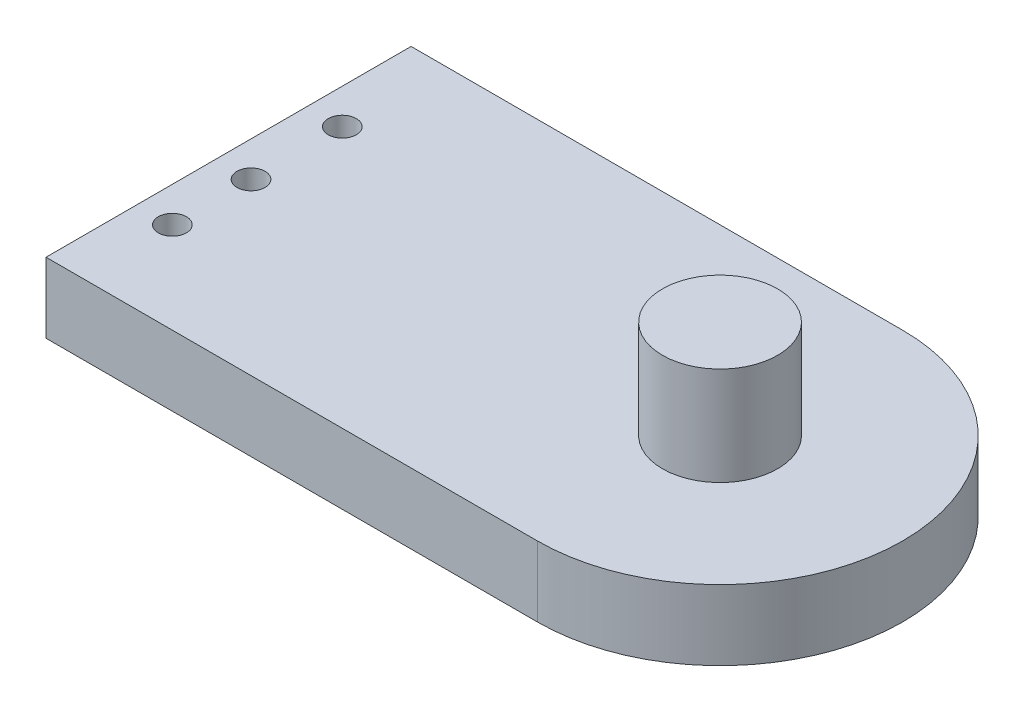
ISO-10303-21;
HEADER;
FILE_DESCRIPTION(('STEP AP214'),'2;1');
FILE_NAME('part.step','',(''),(''),'','','');
FILE_SCHEMA(('AUTOMOTIVE_DESIGN { 1 0 10303 214 1 1 1 1 }'));
ENDSEC;
DATA;
#1=APPLICATION_CONTEXT('core data for automotive mechanical design processes');
#2=APPLICATION_PROTOCOL_DEFINITION('international standard','automotive_design',2000,#1);
#3=PRODUCT_CONTEXT('',#1,'mechanical');
#4=PRODUCT('Part','Part','',(#3));
#5=PRODUCT_RELATED_PRODUCT_CATEGORY('part','',(#4));
#6=PRODUCT_DEFINITION_FORMATION('','',#4);
#7=PRODUCT_DEFINITION_CONTEXT('part definition',#1,'design');
#8=PRODUCT_DEFINITION('design','',#6,#7);
#9=PRODUCT_DEFINITION_SHAPE('','',#8);
#10=(LENGTH_UNIT() NAMED_UNIT(*) SI_UNIT(.MILLI.,.METRE.));
#11=(NAMED_UNIT(*) PLANE_ANGLE_UNIT() SI_UNIT($,.RADIAN.));
#12=(NAMED_UNIT(*) SI_UNIT($,.STERADIAN.) SOLID_ANGLE_UNIT());
#13=UNCERTAINTY_MEASURE_WITH_UNIT(LENGTH_MEASURE(1.E-05),#10,'distance_accuracy_value','');
#14=(GEOMETRIC_REPRESENTATION_CONTEXT(3) GLOBAL_UNCERTAINTY_ASSIGNED_CONTEXT((#13)) GLOBAL_UNIT_ASSIGNED_CONTEXT((#10,
#11,#12)) REPRESENTATION_CONTEXT('',''));
#15=CARTESIAN_POINT('',(0.,0.,0.));
#16=DIRECTION('',(0.,0.,1.));
#17=DIRECTION('',(1.,0.,0.));
#18=AXIS2_PLACEMENT_3D('',#15,#16,#17);
#19=CARTESIAN_POINT('',(0.,5.,0.));
#20=DIRECTION('',(0.,0.,-1.));
#21=DIRECTION('',(-1.,0.,0.));
#22=AXIS2_PLACEMENT_3D('',#19,#20,#21);
#23=PLANE('',#22);
#24=DIRECTION('',(1.,0.,0.));
#25=VECTOR('',#24,1.);
#26=CARTESIAN_POINT('',(0.,0.,0.));
#27=LINE('',#26,#25);
#28=CARTESIAN_POINT('',(0.,0.,0.));
#29=VERTEX_POINT('',#28);
#30=CARTESIAN_POINT('',(35.,0.,0.));
#31=VERTEX_POINT('',#30);
#32=EDGE_CURVE('E109',#29,#31,#27,.T.);
#33=ORIENTED_EDGE('',*,*,#32,.T.);
#34=DIRECTION('',(0.,-1.,0.));
#35=VECTOR('',#34,1.);
#36=CARTESIAN_POINT('',(35.,5.,0.));
#37=LINE('',#36,#35);
#38=CARTESIAN_POINT('',(35.,5.,0.));
#39=VERTEX_POINT('',#38);
#40=EDGE_CURVE('E11',#39,#31,#37,.T.);
#41=ORIENTED_EDGE('',*,*,#40,.F.);
#42=DIRECTION('',(1.,0.,0.));
#43=VECTOR('',#42,1.);
#44=CARTESIAN_POINT('',(0.,5.,0.));
#45=LINE('',#44,#43);
#46=CARTESIAN_POINT('',(0.,5.,0.));
#47=VERTEX_POINT('',#46);
#48=EDGE_CURVE('E95',#47,#39,#45,.T.);
#49=ORIENTED_EDGE('',*,*,#48,.F.);
#50=DIRECTION('',(0.,-1.,0.));
#51=VECTOR('',#50,1.);
#52=CARTESIAN_POINT('',(0.,5.,0.));
#53=LINE('',#52,#51);
#54=EDGE_CURVE('E62',#47,#29,#53,.T.);
#55=ORIENTED_EDGE('',*,*,#54,.T.);
#56=EDGE_LOOP('',(#33,#41,#49,#55));
#57=FACE_BOUND('',#56,.T.);
#58=ADVANCED_FACE('F46',(#57),#23,.F.);
#59=CARTESIAN_POINT('',(35.,5.,-13.));
#60=DIRECTION('',(0.,-1.,0.));
#61=DIRECTION('',(0.,0.,-1.));
#62=AXIS2_PLACEMENT_3D('',#59,#60,#61);
#63=CYLINDRICAL_SURFACE('',#62,13.);
#64=CARTESIAN_POINT('',(35.,0.,-13.));
#65=DIRECTION('',(0.,1.,0.));
#66=DIRECTION('',(0.,0.,1.));
#67=AXIS2_PLACEMENT_3D('',#64,#65,#66);
#68=CIRCLE('',#67,13.);
#69=CARTESIAN_POINT('',(35.,0.,-26.));
#70=VERTEX_POINT('',#69);
#71=EDGE_CURVE('E100',#31,#70,#68,.T.);
#72=ORIENTED_EDGE('',*,*,#71,.T.);
#73=DIRECTION('',(0.,-1.,0.));
#74=VECTOR('',#73,1.);
#75=CARTESIAN_POINT('',(35.,5.,-26.));
#76=LINE('',#75,#74);
#77=CARTESIAN_POINT('',(35.,5.,-26.));
#78=VERTEX_POINT('',#77);
#79=EDGE_CURVE('E54',#78,#70,#76,.T.);
#80=ORIENTED_EDGE('',*,*,#79,.F.);
#81=CARTESIAN_POINT('',(35.,5.,-13.));
#82=DIRECTION('',(0.,1.,0.));
#83=DIRECTION('',(0.,0.,1.));
#84=AXIS2_PLACEMENT_3D('',#81,#82,#83);
#85=CIRCLE('',#84,13.);
#86=EDGE_CURVE('E87',#39,#78,#85,.T.);
#87=ORIENTED_EDGE('',*,*,#86,.F.);
#88=ORIENTED_EDGE('',*,*,#40,.T.);
#89=EDGE_LOOP('',(#72,#80,#87,#88));
#90=FACE_BOUND('',#89,.T.);
#91=ADVANCED_FACE('F99',(#90),#63,.T.);
#92=CARTESIAN_POINT('',(0.,5.,-26.));
#93=DIRECTION('',(0.,0.,-1.));
#94=DIRECTION('',(-1.,0.,0.));
#95=AXIS2_PLACEMENT_3D('',#92,#93,#94);
#96=PLANE('',#95);
#97=DIRECTION('',(1.,0.,0.));
#98=VECTOR('',#97,1.);
#99=CARTESIAN_POINT('',(0.,0.,-26.));
#100=LINE('',#99,#98);
#101=CARTESIAN_POINT('',(0.,0.,-26.));
#102=VERTEX_POINT('',#101);
#103=EDGE_CURVE('E113',#102,#70,#100,.T.);
#104=ORIENTED_EDGE('',*,*,#103,.F.);
#105=DIRECTION('',(0.,-1.,0.));
#106=VECTOR('',#105,1.);
#107=CARTESIAN_POINT('',(0.,5.,-26.));
#108=LINE('',#107,#106);
#109=CARTESIAN_POINT('',(0.,5.,-26.));
#110=VERTEX_POINT('',#109);
#111=EDGE_CURVE('E76',#110,#102,#108,.T.);
#112=ORIENTED_EDGE('',*,*,#111,.F.);
#113=DIRECTION('',(1.,0.,0.));
#114=VECTOR('',#113,1.);
#115=CARTESIAN_POINT('',(0.,5.,-26.));
#116=LINE('',#115,#114);
#117=EDGE_CURVE('E94',#110,#78,#116,.T.);
#118=ORIENTED_EDGE('',*,*,#117,.T.);
#119=ORIENTED_EDGE('',*,*,#79,.T.);
#120=EDGE_LOOP('',(#104,#112,#118,#119));
#121=FACE_BOUND('',#120,.T.);
#122=ADVANCED_FACE('F103',(#121),#96,.T.);
#123=CARTESIAN_POINT('',(0.,5.,0.));
#124=DIRECTION('',(-1.,0.,0.));
#125=DIRECTION('',(0.,0.,1.));
#126=AXIS2_PLACEMENT_3D('',#123,#124,#125);
#127=PLANE('',#126);
#128=DIRECTION('',(0.,0.,-1.));
#129=VECTOR('',#128,1.);
#130=CARTESIAN_POINT('',(0.,0.,0.));
#131=LINE('',#130,#129);
#132=EDGE_CURVE('E115',#29,#102,#131,.T.);
#133=ORIENTED_EDGE('',*,*,#132,.F.);
#134=ORIENTED_EDGE('',*,*,#54,.F.);
#135=DIRECTION('',(0.,0.,-1.));
#136=VECTOR('',#135,1.);
#137=CARTESIAN_POINT('',(0.,5.,0.));
#138=LINE('',#137,#136);
#139=EDGE_CURVE('E104',#47,#110,#138,.T.);
#140=ORIENTED_EDGE('',*,*,#139,.T.);
#141=ORIENTED_EDGE('',*,*,#111,.T.);
#142=EDGE_LOOP('',(#133,#134,#140,#141));
#143=FACE_BOUND('',#142,.T.);
#144=ADVANCED_FACE('F155',(#143),#127,.T.);
#145=CARTESIAN_POINT('',(0.,5.,0.));
#146=DIRECTION('',(0.,1.,0.));
#147=DIRECTION('',(0.,0.,1.));
#148=AXIS2_PLACEMENT_3D('',#145,#146,#147);
#149=PLANE('',#148);
#150=CARTESIAN_POINT('',(2.5,5.,-6.5));
#151=DIRECTION('',(0.,1.,0.));
#152=DIRECTION('',(0.,0.,1.));
#153=AXIS2_PLACEMENT_3D('',#150,#151,#152);
#154=CIRCLE('',#153,0.999999999999988);
#155=CARTESIAN_POINT('',(2.5,5.,-5.50000000000001));
#156=VERTEX_POINT('',#155);
#157=EDGE_CURVE('E138',#156,#156,#154,.T.);
#158=ORIENTED_EDGE('',*,*,#157,.F.);
#159=EDGE_LOOP('',(#158));
#160=FACE_BOUND('',#159,.T.);
#161=CARTESIAN_POINT('',(2.5,5.,-12.1));
#162=DIRECTION('',(0.,1.,0.));
#163=DIRECTION('',(0.,0.,1.));
#164=AXIS2_PLACEMENT_3D('',#161,#162,#163);
#165=CIRCLE('',#164,0.999999999999988);
#166=CARTESIAN_POINT('',(2.5,5.,-11.1));
#167=VERTEX_POINT('',#166);
#168=EDGE_CURVE('E132',#167,#167,#165,.T.);
#169=ORIENTED_EDGE('',*,*,#168,.F.);
#170=EDGE_LOOP('',(#169));
#171=FACE_BOUND('',#170,.T.);
#172=CARTESIAN_POINT('',(2.5,5.,-18.6));
#173=DIRECTION('',(0.,1.,0.));
#174=DIRECTION('',(0.,0.,1.));
#175=AXIS2_PLACEMENT_3D('',#172,#173,#174);
#176=CIRCLE('',#175,0.999999999999988);
#177=CARTESIAN_POINT('',(2.5,5.,-17.6));
#178=VERTEX_POINT('',#177);
#179=EDGE_CURVE('E124',#178,#178,#176,.T.);
#180=ORIENTED_EDGE('',*,*,#179,.F.);
#181=EDGE_LOOP('',(#180));
#182=FACE_BOUND('',#181,.T.);
#183=CARTESIAN_POINT('',(35.,5.,-13.));
#184=DIRECTION('',(0.,1.,0.));
#185=DIRECTION('',(0.,0.,1.));
#186=AXIS2_PLACEMENT_3D('',#183,#184,#185);
#187=CIRCLE('',#186,4.1);
#188=CARTESIAN_POINT('',(35.,5.,-8.9));
#189=VERTEX_POINT('',#188);
#190=EDGE_CURVE('E121',#189,#189,#187,.T.);
#191=ORIENTED_EDGE('',*,*,#190,.F.);
#192=EDGE_LOOP('',(#191));
#193=FACE_BOUND('',#192,.T.);
#194=ORIENTED_EDGE('',*,*,#48,.T.);
#195=ORIENTED_EDGE('',*,*,#86,.T.);
#196=ORIENTED_EDGE('',*,*,#117,.F.);
#197=ORIENTED_EDGE('',*,*,#139,.F.);
#198=EDGE_LOOP('',(#194,#195,#196,#197));
#199=FACE_BOUND('',#198,.T.);
#200=ADVANCED_FACE('F91',(#160,#171,#182,#193,#199),#149,.T.);
#201=CARTESIAN_POINT('',(0.,0.,0.));
#202=DIRECTION('',(0.,1.,0.));
#203=DIRECTION('',(0.,0.,1.));
#204=AXIS2_PLACEMENT_3D('',#201,#202,#203);
#205=PLANE('',#204);
#206=CARTESIAN_POINT('',(2.5,0.,-6.5));
#207=DIRECTION('',(0.,-1.,0.));
#208=DIRECTION('',(0.,0.,-1.));
#209=AXIS2_PLACEMENT_3D('',#206,#207,#208);
#210=CIRCLE('',#209,0.999999999999989);
#211=CARTESIAN_POINT('',(2.5,0.,-7.49999999999999));
#212=VERTEX_POINT('',#211);
#213=EDGE_CURVE('E141',#212,#212,#210,.T.);
#214=ORIENTED_EDGE('',*,*,#213,.F.);
#215=EDGE_LOOP('',(#214));
#216=FACE_BOUND('',#215,.T.);
#217=CARTESIAN_POINT('',(2.5,0.,-12.1));
#218=DIRECTION('',(0.,-1.,0.));
#219=DIRECTION('',(0.,0.,-1.));
#220=AXIS2_PLACEMENT_3D('',#217,#218,#219);
#221=CIRCLE('',#220,0.999999999999989);
#222=CARTESIAN_POINT('',(2.5,0.,-13.1));
#223=VERTEX_POINT('',#222);
#224=EDGE_CURVE('E135',#223,#223,#221,.T.);
#225=ORIENTED_EDGE('',*,*,#224,.F.);
#226=EDGE_LOOP('',(#225));
#227=FACE_BOUND('',#226,.T.);
#228=CARTESIAN_POINT('',(2.5,0.,-18.6));
#229=DIRECTION('',(0.,-1.,0.));
#230=DIRECTION('',(0.,0.,-1.));
#231=AXIS2_PLACEMENT_3D('',#228,#229,#230);
#232=CIRCLE('',#231,0.999999999999989);
#233=CARTESIAN_POINT('',(2.5,0.,-19.6));
#234=VERTEX_POINT('',#233);
#235=EDGE_CURVE('E129',#234,#234,#232,.T.);
#236=ORIENTED_EDGE('',*,*,#235,.F.);
#237=EDGE_LOOP('',(#236));
#238=FACE_BOUND('',#237,.T.);
#239=ORIENTED_EDGE('',*,*,#32,.F.);
#240=ORIENTED_EDGE('',*,*,#132,.T.);
#241=ORIENTED_EDGE('',*,*,#103,.T.);
#242=ORIENTED_EDGE('',*,*,#71,.F.);
#243=EDGE_LOOP('',(#239,#240,#241,#242));
#244=FACE_BOUND('',#243,.T.);
#245=ADVANCED_FACE('F147',(#216,#227,#238,#244),#205,.F.);
#246=CARTESIAN_POINT('',(35.,12.,-13.));
#247=DIRECTION('',(0.,-1.,0.));
#248=DIRECTION('',(0.,0.,-1.));
#249=AXIS2_PLACEMENT_3D('',#246,#247,#248);
#250=CYLINDRICAL_SURFACE('',#249,4.1);
#251=CARTESIAN_POINT('',(35.,12.,-13.));
#252=DIRECTION('',(0.,1.,0.));
#253=DIRECTION('',(0.,0.,1.));
#254=AXIS2_PLACEMENT_3D('',#251,#252,#253);
#255=CIRCLE('',#254,4.1);
#256=CARTESIAN_POINT('',(35.,12.,-8.9));
#257=VERTEX_POINT('',#256);
#258=EDGE_CURVE('E111',#257,#257,#255,.T.);
#259=ORIENTED_EDGE('',*,*,#258,.F.);
#260=EDGE_LOOP('',(#259));
#261=FACE_BOUND('',#260,.T.);
#262=ORIENTED_EDGE('',*,*,#190,.T.);
#263=EDGE_LOOP('',(#262));
#264=FACE_BOUND('',#263,.T.);
#265=ADVANCED_FACE('F150',(#261,#264),#250,.T.);
#266=CARTESIAN_POINT('',(35.,12.,-13.));
#267=DIRECTION('',(0.,1.,0.));
#268=DIRECTION('',(0.,0.,1.));
#269=AXIS2_PLACEMENT_3D('',#266,#267,#268);
#270=PLANE('',#269);
#271=ORIENTED_EDGE('',*,*,#258,.T.);
#272=EDGE_LOOP('',(#271));
#273=FACE_BOUND('',#272,.T.);
#274=ADVANCED_FACE('F210',(#273),#270,.T.);
#275=CARTESIAN_POINT('',(2.5,0.,-18.6));
#276=DIRECTION('',(0.,-1.,0.));
#277=DIRECTION('',(0.,0.,-1.));
#278=AXIS2_PLACEMENT_3D('',#275,#276,#277);
#279=CYLINDRICAL_SURFACE('',#278,0.999999999999988);
#280=ORIENTED_EDGE('',*,*,#179,.T.);
#281=EDGE_LOOP('',(#280));
#282=FACE_BOUND('',#281,.T.);
#283=ORIENTED_EDGE('',*,*,#235,.T.);
#284=EDGE_LOOP('',(#283));
#285=FACE_BOUND('',#284,.T.);
#286=ADVANCED_FACE('F219',(#282,#285),#279,.F.);
#287=CARTESIAN_POINT('',(2.5,0.,-12.1));
#288=DIRECTION('',(0.,-1.,0.));
#289=DIRECTION('',(0.,0.,-1.));
#290=AXIS2_PLACEMENT_3D('',#287,#288,#289);
#291=CYLINDRICAL_SURFACE('',#290,0.999999999999988);
#292=ORIENTED_EDGE('',*,*,#168,.T.);
#293=EDGE_LOOP('',(#292));
#294=FACE_BOUND('',#293,.T.);
#295=ORIENTED_EDGE('',*,*,#224,.T.);
#296=EDGE_LOOP('',(#295));
#297=FACE_BOUND('',#296,.T.);
#298=ADVANCED_FACE('F228',(#294,#297),#291,.F.);
#299=CARTESIAN_POINT('',(2.5,0.,-6.5));
#300=DIRECTION('',(0.,-1.,0.));
#301=DIRECTION('',(0.,0.,-1.));
#302=AXIS2_PLACEMENT_3D('',#299,#300,#301);
#303=CYLINDRICAL_SURFACE('',#302,0.999999999999988);
#304=ORIENTED_EDGE('',*,*,#157,.T.);
#305=EDGE_LOOP('',(#304));
#306=FACE_BOUND('',#305,.T.);
#307=ORIENTED_EDGE('',*,*,#213,.T.);
#308=EDGE_LOOP('',(#307));
#309=FACE_BOUND('',#308,.T.);
#310=ADVANCED_FACE('F145',(#306,#309),#303,.F.);
#311=CLOSED_SHELL('',(#58,#91,#122,#144,#200,#245,#265,#274,#286,#298,#310));
#312=MANIFOLD_SOLID_BREP('B2',#311);
#313=ADVANCED_BREP_SHAPE_REPRESENTATION('',(#18,#312),#14);
#314=SHAPE_DEFINITION_REPRESENTATION(#9,#313);
ENDSEC;
END-ISO-10303-21;
